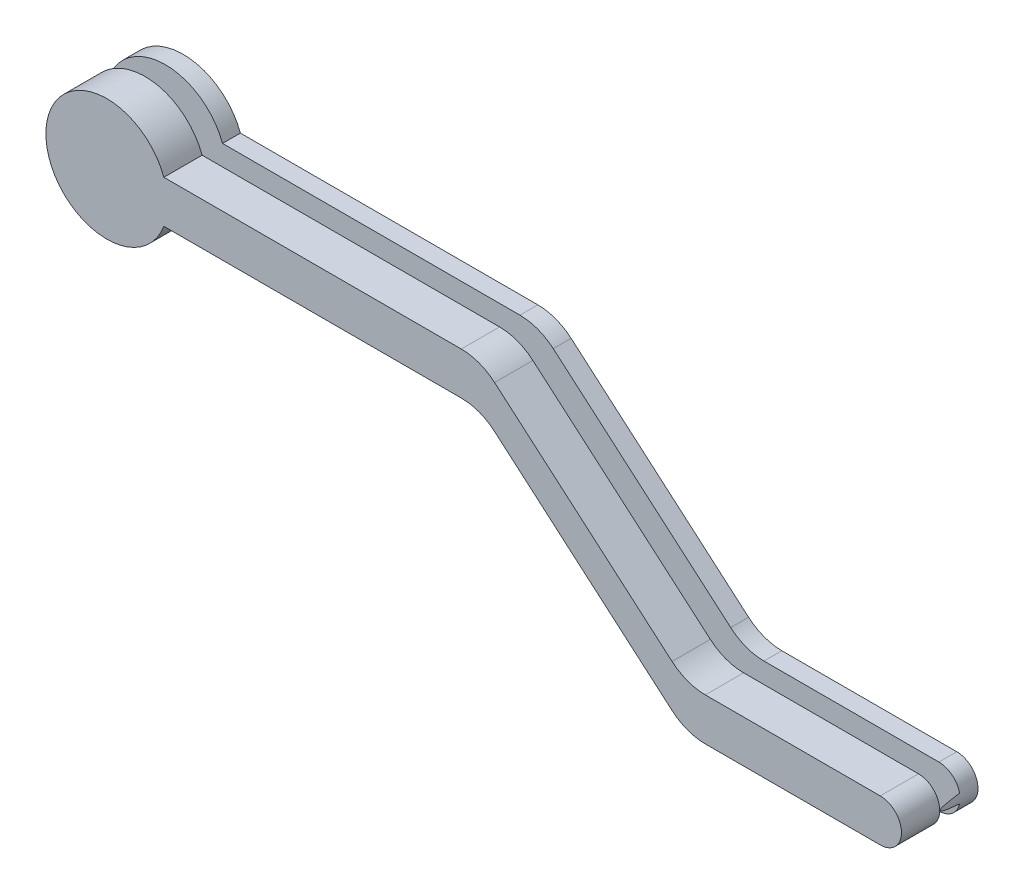
ISO-10303-21;
HEADER;
FILE_DESCRIPTION(('STEP AP214'),'2;1');
FILE_NAME('part.step','',(''),(''),'','','');
FILE_SCHEMA(('AUTOMOTIVE_DESIGN { 1 0 10303 214 1 1 1 1 }'));
ENDSEC;
DATA;
#1=APPLICATION_CONTEXT('core data for automotive mechanical design processes');
#2=APPLICATION_PROTOCOL_DEFINITION('international standard','automotive_design',2000,#1);
#3=PRODUCT_CONTEXT('',#1,'mechanical');
#4=PRODUCT('Part','Part','',(#3));
#5=PRODUCT_RELATED_PRODUCT_CATEGORY('part','',(#4));
#6=PRODUCT_DEFINITION_FORMATION('','',#4);
#7=PRODUCT_DEFINITION_CONTEXT('part definition',#1,'design');
#8=PRODUCT_DEFINITION('design','',#6,#7);
#9=PRODUCT_DEFINITION_SHAPE('','',#8);
#10=(LENGTH_UNIT() NAMED_UNIT(*) SI_UNIT(.MILLI.,.METRE.));
#11=(NAMED_UNIT(*) PLANE_ANGLE_UNIT() SI_UNIT($,.RADIAN.));
#12=(NAMED_UNIT(*) SI_UNIT($,.STERADIAN.) SOLID_ANGLE_UNIT());
#13=UNCERTAINTY_MEASURE_WITH_UNIT(LENGTH_MEASURE(1.E-05),#10,'distance_accuracy_value','');
#14=(GEOMETRIC_REPRESENTATION_CONTEXT(3) GLOBAL_UNCERTAINTY_ASSIGNED_CONTEXT((#13)) GLOBAL_UNIT_ASSIGNED_CONTEXT((#10,
#11,#12)) REPRESENTATION_CONTEXT('',''));
#15=CARTESIAN_POINT('',(0.,0.,0.));
#16=DIRECTION('',(0.,0.,1.));
#17=DIRECTION('',(1.,0.,0.));
#18=AXIS2_PLACEMENT_3D('',#15,#16,#17);
#19=CARTESIAN_POINT('',(0.,0.,15.));
#20=DIRECTION('',(0.,0.,-1.));
#21=DIRECTION('',(-1.,0.,0.));
#22=AXIS2_PLACEMENT_3D('',#19,#20,#21);
#23=CYLINDRICAL_SURFACE('',#22,11.936209112815);
#24=CARTESIAN_POINT('',(0.,0.,3.50341480726667));
#25=DIRECTION('',(0.,0.,-1.));
#26=DIRECTION('',(-1.,0.,0.));
#27=AXIS2_PLACEMENT_3D('',#24,#25,#26);
#28=CIRCLE('',#27,11.936209112815);
#29=CARTESIAN_POINT('',(11.1871739616076,-4.1617576500294,3.50341480726667));
#30=VERTEX_POINT('',#29);
#31=CARTESIAN_POINT('',(11.1871739616076,4.1617576500294,3.50341480726667));
#32=VERTEX_POINT('',#31);
#33=EDGE_CURVE('E154',#30,#32,#28,.T.);
#34=ORIENTED_EDGE('',*,*,#33,.T.);
#35=DIRECTION('',(0.,0.,-1.));
#36=VECTOR('',#35,1.);
#37=CARTESIAN_POINT('',(11.1871739616076,4.1617576500294,15.));
#38=LINE('',#37,#36);
#39=CARTESIAN_POINT('',(11.1871739616076,4.1617576500294,0.));
#40=VERTEX_POINT('',#39);
#41=EDGE_CURVE('E56',#32,#40,#38,.T.);
#42=ORIENTED_EDGE('',*,*,#41,.T.);
#43=CARTESIAN_POINT('',(0.,0.,0.));
#44=DIRECTION('',(0.,0.,1.));
#45=DIRECTION('',(1.,0.,0.));
#46=AXIS2_PLACEMENT_3D('',#43,#44,#45);
#47=CIRCLE('',#46,11.936209112815);
#48=CARTESIAN_POINT('',(11.1871739616076,-4.1617576500294,0.));
#49=VERTEX_POINT('',#48);
#50=EDGE_CURVE('E222',#40,#49,#47,.T.);
#51=ORIENTED_EDGE('',*,*,#50,.T.);
#52=DIRECTION('',(0.,0.,-1.));
#53=VECTOR('',#52,1.);
#54=CARTESIAN_POINT('',(11.1871739616076,-4.1617576500294,15.));
#55=LINE('',#54,#53);
#56=EDGE_CURVE('E206',#30,#49,#55,.T.);
#57=ORIENTED_EDGE('',*,*,#56,.F.);
#58=EDGE_LOOP('',(#34,#42,#51,#57));
#59=FACE_BOUND('',#58,.T.);
#60=ADVANCED_FACE('F53',(#59),#23,.T.);
#61=CARTESIAN_POINT('',(11.1871739616076,-4.1617576500294,15.));
#62=DIRECTION('',(0.,1.,0.));
#63=DIRECTION('',(0.,0.,1.));
#64=AXIS2_PLACEMENT_3D('',#61,#62,#63);
#65=PLANE('',#64);
#66=DIRECTION('',(0.,0.,-1.));
#67=VECTOR('',#66,1.);
#68=CARTESIAN_POINT('',(69.4870218943338,-4.1617576500294,15.));
#69=LINE('',#68,#67);
#70=CARTESIAN_POINT('',(69.4870218943338,-4.1617576500294,3.50341480726667));
#71=VERTEX_POINT('',#70);
#72=CARTESIAN_POINT('',(69.4870218943338,-4.1617576500294,0.));
#73=VERTEX_POINT('',#72);
#74=EDGE_CURVE('E202',#71,#73,#69,.T.);
#75=ORIENTED_EDGE('',*,*,#74,.F.);
#76=DIRECTION('',(-1.,0.,0.));
#77=VECTOR('',#76,1.);
#78=CARTESIAN_POINT('',(11.1871739616076,-4.1617576500294,3.50341480726667));
#79=LINE('',#78,#77);
#80=EDGE_CURVE('E209',#71,#30,#79,.T.);
#81=ORIENTED_EDGE('',*,*,#80,.T.);
#82=ORIENTED_EDGE('',*,*,#56,.T.);
#83=DIRECTION('',(1.,0.,0.));
#84=VECTOR('',#83,1.);
#85=CARTESIAN_POINT('',(11.1871739616076,-4.1617576500294,0.));
#86=LINE('',#85,#84);
#87=EDGE_CURVE('E208',#49,#73,#86,.T.);
#88=ORIENTED_EDGE('',*,*,#87,.T.);
#89=EDGE_LOOP('',(#75,#81,#82,#88));
#90=FACE_BOUND('',#89,.T.);
#91=ADVANCED_FACE('F277',(#90),#65,.F.);
#92=CARTESIAN_POINT('',(69.4870218943338,-14.1617576500294,15.));
#93=DIRECTION('',(0.,0.,-1.));
#94=DIRECTION('',(-1.,0.,0.));
#95=AXIS2_PLACEMENT_3D('',#92,#93,#94);
#96=CYLINDRICAL_SURFACE('',#95,10.);
#97=DIRECTION('',(0.,0.,-1.));
#98=VECTOR('',#97,1.);
#99=CARTESIAN_POINT('',(76.0128315018263,-6.58456760577429,15.));
#100=LINE('',#99,#98);
#101=CARTESIAN_POINT('',(76.0128315018263,-6.58456760577429,3.50341480726667));
#102=VERTEX_POINT('',#101);
#103=CARTESIAN_POINT('',(76.0128315018263,-6.58456760577429,0.));
#104=VERTEX_POINT('',#103);
#105=EDGE_CURVE('E198',#102,#104,#100,.T.);
#106=ORIENTED_EDGE('',*,*,#105,.F.);
#107=CARTESIAN_POINT('',(69.4870218943338,-14.1617576500294,3.50341480726667));
#108=DIRECTION('',(0.,0.,-1.));
#109=DIRECTION('',(-1.,0.,0.));
#110=AXIS2_PLACEMENT_3D('',#107,#108,#109);
#111=CIRCLE('',#110,10.);
#112=EDGE_CURVE('E205',#102,#71,#111,.F.);
#113=ORIENTED_EDGE('',*,*,#112,.T.);
#114=ORIENTED_EDGE('',*,*,#74,.T.);
#115=CARTESIAN_POINT('',(69.4870218943338,-14.1617576500294,0.));
#116=DIRECTION('',(0.,0.,-1.));
#117=DIRECTION('',(1.,0.,0.));
#118=AXIS2_PLACEMENT_3D('',#115,#116,#117);
#119=CIRCLE('',#118,10.);
#120=EDGE_CURVE('E204',#73,#104,#119,.T.);
#121=ORIENTED_EDGE('',*,*,#120,.T.);
#122=EDGE_LOOP('',(#106,#113,#114,#121));
#123=FACE_BOUND('',#122,.T.);
#124=ADVANCED_FACE('F282',(#123),#96,.F.);
#125=CARTESIAN_POINT('',(76.0128315018263,-6.58456760577429,15.));
#126=DIRECTION('',(0.652580960749246,0.757719004425513,0.));
#127=DIRECTION('',(-0.757719004425513,0.652580960749246,0.));
#128=AXIS2_PLACEMENT_3D('',#125,#126,#127);
#129=PLANE('',#128);
#130=DIRECTION('',(0.,0.,-1.));
#131=VECTOR('',#130,1.);
#132=CARTESIAN_POINT('',(110.79266281374,-36.538489309815,15.));
#133=LINE('',#132,#131);
#134=CARTESIAN_POINT('',(110.79266281374,-36.538489309815,3.50341480726667));
#135=VERTEX_POINT('',#134);
#136=CARTESIAN_POINT('',(110.79266281374,-36.538489309815,0.));
#137=VERTEX_POINT('',#136);
#138=EDGE_CURVE('E194',#135,#137,#133,.T.);
#139=ORIENTED_EDGE('',*,*,#138,.F.);
#140=DIRECTION('',(-0.757719004425513,0.652580960749246,0.));
#141=VECTOR('',#140,1.);
#142=CARTESIAN_POINT('',(76.0128315018263,-6.58456760577429,3.50341480726667));
#143=LINE('',#142,#141);
#144=EDGE_CURVE('E201',#135,#102,#143,.T.);
#145=ORIENTED_EDGE('',*,*,#144,.T.);
#146=ORIENTED_EDGE('',*,*,#105,.T.);
#147=DIRECTION('',(0.757719004425513,-0.652580960749246,0.));
#148=VECTOR('',#147,1.);
#149=CARTESIAN_POINT('',(76.0128315018263,-6.58456760577429,0.));
#150=LINE('',#149,#148);
#151=EDGE_CURVE('E200',#104,#137,#150,.T.);
#152=ORIENTED_EDGE('',*,*,#151,.T.);
#153=EDGE_LOOP('',(#139,#145,#146,#152));
#154=FACE_BOUND('',#153,.T.);
#155=ADVANCED_FACE('F285',(#154),#129,.F.);
#156=CARTESIAN_POINT('',(117.318472421233,-28.9612992655599,15.));
#157=DIRECTION('',(0.,0.,-1.));
#158=DIRECTION('',(-1.,0.,0.));
#159=AXIS2_PLACEMENT_3D('',#156,#157,#158);
#160=CYLINDRICAL_SURFACE('',#159,10.);
#161=DIRECTION('',(0.,0.,-1.));
#162=VECTOR('',#161,1.);
#163=CARTESIAN_POINT('',(117.318472421233,-38.9612992655599,15.));
#164=LINE('',#163,#162);
#165=CARTESIAN_POINT('',(117.318472421233,-38.9612992655599,3.50341480726667));
#166=VERTEX_POINT('',#165);
#167=CARTESIAN_POINT('',(117.318472421233,-38.9612992655599,0.));
#168=VERTEX_POINT('',#167);
#169=EDGE_CURVE('E191',#166,#168,#164,.T.);
#170=ORIENTED_EDGE('',*,*,#169,.F.);
#171=CARTESIAN_POINT('',(117.318472421233,-28.9612992655599,3.50341480726667));
#172=DIRECTION('',(0.,0.,-1.));
#173=DIRECTION('',(-1.,0.,0.));
#174=AXIS2_PLACEMENT_3D('',#171,#172,#173);
#175=CIRCLE('',#174,10.);
#176=EDGE_CURVE('E197',#166,#135,#175,.T.);
#177=ORIENTED_EDGE('',*,*,#176,.T.);
#178=ORIENTED_EDGE('',*,*,#138,.T.);
#179=CARTESIAN_POINT('',(117.318472421233,-28.9612992655599,0.));
#180=DIRECTION('',(0.,0.,1.));
#181=DIRECTION('',(-1.,0.,0.));
#182=AXIS2_PLACEMENT_3D('',#179,#180,#181);
#183=CIRCLE('',#182,10.);
#184=EDGE_CURVE('E196',#137,#168,#183,.T.);
#185=ORIENTED_EDGE('',*,*,#184,.T.);
#186=EDGE_LOOP('',(#170,#177,#178,#185));
#187=FACE_BOUND('',#186,.T.);
#188=ADVANCED_FACE('F287',(#187),#160,.T.);
#189=CARTESIAN_POINT('',(117.318472421233,-38.9612992655599,15.));
#190=DIRECTION('',(0.,1.,0.));
#191=DIRECTION('',(0.,0.,1.));
#192=AXIS2_PLACEMENT_3D('',#189,#190,#191);
#193=PLANE('',#192);
#194=DIRECTION('',(0.,0.,-1.));
#195=VECTOR('',#194,1.);
#196=CARTESIAN_POINT('',(151.60094540579,-38.9612992655599,15.));
#197=LINE('',#196,#195);
#198=CARTESIAN_POINT('',(151.60094540579,-38.9612992655599,3.50341480726667));
#199=VERTEX_POINT('',#198);
#200=CARTESIAN_POINT('',(151.60094540579,-38.9612992655599,0.));
#201=VERTEX_POINT('',#200);
#202=EDGE_CURVE('E188',#199,#201,#197,.T.);
#203=ORIENTED_EDGE('',*,*,#202,.F.);
#204=DIRECTION('',(-1.,0.,0.));
#205=VECTOR('',#204,1.);
#206=CARTESIAN_POINT('',(-11.936209112815,-38.9612992655599,3.50341480726667));
#207=LINE('',#206,#205);
#208=EDGE_CURVE('E74',#199,#166,#207,.T.);
#209=ORIENTED_EDGE('',*,*,#208,.T.);
#210=ORIENTED_EDGE('',*,*,#169,.T.);
#211=DIRECTION('',(1.,0.,0.));
#212=VECTOR('',#211,1.);
#213=CARTESIAN_POINT('',(117.318472421233,-38.9612992655599,0.));
#214=LINE('',#213,#212);
#215=EDGE_CURVE('E193',#168,#201,#214,.T.);
#216=ORIENTED_EDGE('',*,*,#215,.T.);
#217=EDGE_LOOP('',(#203,#209,#210,#216));
#218=FACE_BOUND('',#217,.T.);
#219=ADVANCED_FACE('F254',(#218),#193,.F.);
#220=CARTESIAN_POINT('',(151.60094540579,-34.7995416155305,15.));
#221=DIRECTION('',(0.,0.,-1.));
#222=DIRECTION('',(-1.,0.,0.));
#223=AXIS2_PLACEMENT_3D('',#220,#221,#222);
#224=CYLINDRICAL_SURFACE('',#223,4.16175765002941);
#225=CARTESIAN_POINT('',(151.60094540579,-34.7995416155305,-154.812224721444));
#226=DIRECTION('',(0.999671445786152,0.,-0.0256320205958389));
#227=DIRECTION('',(-0.0256320205958389,0.,-0.999671445786152));
#228=AXIS2_PLACEMENT_3D('',#225,#226,#227);
#229=ELLIPSE('',#228,162.365570613852,4.16175765002941);
#230=CARTESIAN_POINT('',(155.660228833509,-33.8816937027331,3.50341480726667));
#231=VERTEX_POINT('',#230);
#232=CARTESIAN_POINT('',(155.660228833509,-35.717389528328,3.50341480726667));
#233=VERTEX_POINT('',#232);
#234=EDGE_CURVE('E84',#231,#233,#229,.T.);
#235=ORIENTED_EDGE('',*,*,#234,.T.);
#236=CARTESIAN_POINT('',(151.60094540579,-34.7995416155305,3.50341480726667));
#237=DIRECTION('',(0.,0.,-1.));
#238=DIRECTION('',(-1.,0.,0.));
#239=AXIS2_PLACEMENT_3D('',#236,#237,#238);
#240=CIRCLE('',#239,4.16175765002941);
#241=EDGE_CURVE('E68',#233,#199,#240,.T.);
#242=ORIENTED_EDGE('',*,*,#241,.T.);
#243=ORIENTED_EDGE('',*,*,#202,.T.);
#244=CARTESIAN_POINT('',(151.60094540579,-34.7995416155305,0.));
#245=DIRECTION('',(0.,0.,1.));
#246=DIRECTION('',(-1.,0.,0.));
#247=AXIS2_PLACEMENT_3D('',#244,#245,#246);
#248=CIRCLE('',#247,4.16175765002941);
#249=CARTESIAN_POINT('',(151.60094540579,-30.6377839655011,0.));
#250=VERTEX_POINT('',#249);
#251=EDGE_CURVE('E190',#201,#250,#248,.T.);
#252=ORIENTED_EDGE('',*,*,#251,.T.);
#253=DIRECTION('',(0.,0.,-1.));
#254=VECTOR('',#253,1.);
#255=CARTESIAN_POINT('',(151.60094540579,-30.6377839655011,15.));
#256=LINE('',#255,#254);
#257=CARTESIAN_POINT('',(151.60094540579,-30.6377839655011,3.50341480726667));
#258=VERTEX_POINT('',#257);
#259=EDGE_CURVE('E184',#258,#250,#256,.T.);
#260=ORIENTED_EDGE('',*,*,#259,.F.);
#261=EDGE_CURVE('E216',#258,#231,#240,.T.);
#262=ORIENTED_EDGE('',*,*,#261,.T.);
#263=EDGE_LOOP('',(#235,#242,#243,#252,#260,#262));
#264=FACE_BOUND('',#263,.T.);
#265=ADVANCED_FACE('F252',(#264),#224,.T.);
#266=CARTESIAN_POINT('',(117.318472421233,-30.6377839655011,15.));
#267=DIRECTION('',(0.,-1.,0.));
#268=DIRECTION('',(0.,0.,-1.));
#269=AXIS2_PLACEMENT_3D('',#266,#267,#268);
#270=PLANE('',#269);
#271=DIRECTION('',(0.,0.,-1.));
#272=VECTOR('',#271,1.);
#273=CARTESIAN_POINT('',(117.318472421233,-30.6377839655011,15.));
#274=LINE('',#273,#272);
#275=CARTESIAN_POINT('',(117.318472421233,-30.6377839655011,3.50341480726667));
#276=VERTEX_POINT('',#275);
#277=CARTESIAN_POINT('',(117.318472421233,-30.6377839655011,0.));
#278=VERTEX_POINT('',#277);
#279=EDGE_CURVE('E180',#276,#278,#274,.T.);
#280=ORIENTED_EDGE('',*,*,#279,.F.);
#281=DIRECTION('',(1.,0.,0.));
#282=VECTOR('',#281,1.);
#283=CARTESIAN_POINT('',(117.318472421233,-30.6377839655011,3.50341480726667));
#284=LINE('',#283,#282);
#285=EDGE_CURVE('E187',#276,#258,#284,.T.);
#286=ORIENTED_EDGE('',*,*,#285,.T.);
#287=ORIENTED_EDGE('',*,*,#259,.T.);
#288=DIRECTION('',(-1.,0.,0.));
#289=VECTOR('',#288,1.);
#290=CARTESIAN_POINT('',(117.318472421233,-30.6377839655011,0.));
#291=LINE('',#290,#289);
#292=EDGE_CURVE('E186',#250,#278,#291,.T.);
#293=ORIENTED_EDGE('',*,*,#292,.T.);
#294=EDGE_LOOP('',(#280,#286,#287,#293));
#295=FACE_BOUND('',#294,.T.);
#296=ADVANCED_FACE('F267',(#295),#270,.F.);
#297=CARTESIAN_POINT('',(117.318472421233,-20.6377839655011,15.));
#298=DIRECTION('',(0.,0.,-1.));
#299=DIRECTION('',(-1.,0.,0.));
#300=AXIS2_PLACEMENT_3D('',#297,#298,#299);
#301=CYLINDRICAL_SURFACE('',#300,10.);
#302=DIRECTION('',(0.,0.,-1.));
#303=VECTOR('',#302,1.);
#304=CARTESIAN_POINT('',(110.79266281374,-28.2149740097562,15.));
#305=LINE('',#304,#303);
#306=CARTESIAN_POINT('',(110.79266281374,-28.2149740097562,3.50341480726667));
#307=VERTEX_POINT('',#306);
#308=CARTESIAN_POINT('',(110.79266281374,-28.2149740097562,0.));
#309=VERTEX_POINT('',#308);
#310=EDGE_CURVE('E178',#307,#309,#305,.T.);
#311=ORIENTED_EDGE('',*,*,#310,.F.);
#312=CARTESIAN_POINT('',(117.318472421233,-20.6377839655011,3.50341480726667));
#313=DIRECTION('',(0.,0.,-1.));
#314=DIRECTION('',(-1.,0.,0.));
#315=AXIS2_PLACEMENT_3D('',#312,#313,#314);
#316=CIRCLE('',#315,10.);
#317=EDGE_CURVE('E183',#307,#276,#316,.F.);
#318=ORIENTED_EDGE('',*,*,#317,.T.);
#319=ORIENTED_EDGE('',*,*,#279,.T.);
#320=CARTESIAN_POINT('',(117.318472421233,-20.6377839655011,0.));
#321=DIRECTION('',(0.,0.,-1.));
#322=DIRECTION('',(-1.,0.,0.));
#323=AXIS2_PLACEMENT_3D('',#320,#321,#322);
#324=CIRCLE('',#323,10.);
#325=EDGE_CURVE('E182',#278,#309,#324,.T.);
#326=ORIENTED_EDGE('',*,*,#325,.T.);
#327=EDGE_LOOP('',(#311,#318,#319,#326));
#328=FACE_BOUND('',#327,.T.);
#329=ADVANCED_FACE('F270',(#328),#301,.F.);
#330=CARTESIAN_POINT('',(76.0128315018263,1.73894769428451,15.));
#331=DIRECTION('',(-0.652580960749246,-0.757719004425513,0.));
#332=DIRECTION('',(0.757719004425513,-0.652580960749246,0.));
#333=AXIS2_PLACEMENT_3D('',#330,#331,#332);
#334=PLANE('',#333);
#335=DIRECTION('',(0.,0.,-1.));
#336=VECTOR('',#335,1.);
#337=CARTESIAN_POINT('',(76.0128315018263,1.73894769428451,15.));
#338=LINE('',#337,#336);
#339=CARTESIAN_POINT('',(76.0128315018263,1.73894769428451,3.50341480726667));
#340=VERTEX_POINT('',#339);
#341=CARTESIAN_POINT('',(76.0128315018263,1.73894769428451,0.));
#342=VERTEX_POINT('',#341);
#343=EDGE_CURVE('E166',#340,#342,#338,.T.);
#344=ORIENTED_EDGE('',*,*,#343,.F.);
#345=DIRECTION('',(0.757719004425514,-0.652580960749246,0.));
#346=VECTOR('',#345,1.);
#347=CARTESIAN_POINT('',(76.0128315018263,1.73894769428451,3.50341480726667));
#348=LINE('',#347,#346);
#349=EDGE_CURVE('E163',#340,#307,#348,.T.);
#350=ORIENTED_EDGE('',*,*,#349,.T.);
#351=ORIENTED_EDGE('',*,*,#310,.T.);
#352=DIRECTION('',(-0.757719004425514,0.652580960749246,0.));
#353=VECTOR('',#352,1.);
#354=CARTESIAN_POINT('',(76.0128315018263,1.73894769428451,0.));
#355=LINE('',#354,#353);
#356=EDGE_CURVE('E167',#309,#342,#355,.T.);
#357=ORIENTED_EDGE('',*,*,#356,.T.);
#358=EDGE_LOOP('',(#344,#350,#351,#357));
#359=FACE_BOUND('',#358,.T.);
#360=ADVANCED_FACE('F273',(#359),#334,.F.);
#361=CARTESIAN_POINT('',(69.4870218943338,-5.8382423499706,15.));
#362=DIRECTION('',(0.,0.,-1.));
#363=DIRECTION('',(-1.,0.,0.));
#364=AXIS2_PLACEMENT_3D('',#361,#362,#363);
#365=CYLINDRICAL_SURFACE('',#364,10.);
#366=DIRECTION('',(0.,0.,-1.));
#367=VECTOR('',#366,1.);
#368=CARTESIAN_POINT('',(69.4870218943338,4.1617576500294,15.));
#369=LINE('',#368,#367);
#370=CARTESIAN_POINT('',(69.4870218943338,4.1617576500294,3.50341480726667));
#371=VERTEX_POINT('',#370);
#372=CARTESIAN_POINT('',(69.4870218943338,4.1617576500294,0.));
#373=VERTEX_POINT('',#372);
#374=EDGE_CURVE('E95',#371,#373,#369,.T.);
#375=ORIENTED_EDGE('',*,*,#374,.F.);
#376=CARTESIAN_POINT('',(69.4870218943338,-5.8382423499706,3.50341480726667));
#377=DIRECTION('',(0.,0.,-1.));
#378=DIRECTION('',(-1.,0.,0.));
#379=AXIS2_PLACEMENT_3D('',#376,#377,#378);
#380=CIRCLE('',#379,10.);
#381=EDGE_CURVE('E158',#371,#340,#380,.T.);
#382=ORIENTED_EDGE('',*,*,#381,.T.);
#383=ORIENTED_EDGE('',*,*,#343,.T.);
#384=CARTESIAN_POINT('',(69.4870218943338,-5.8382423499706,0.));
#385=DIRECTION('',(0.,0.,1.));
#386=DIRECTION('',(1.,0.,0.));
#387=AXIS2_PLACEMENT_3D('',#384,#385,#386);
#388=CIRCLE('',#387,10.);
#389=EDGE_CURVE('E170',#342,#373,#388,.T.);
#390=ORIENTED_EDGE('',*,*,#389,.T.);
#391=EDGE_LOOP('',(#375,#382,#383,#390));
#392=FACE_BOUND('',#391,.T.);
#393=ADVANCED_FACE('F172',(#392),#365,.T.);
#394=CARTESIAN_POINT('',(11.1871739616076,4.1617576500294,15.));
#395=DIRECTION('',(0.,-1.,0.));
#396=DIRECTION('',(0.,0.,-1.));
#397=AXIS2_PLACEMENT_3D('',#394,#395,#396);
#398=PLANE('',#397);
#399=ORIENTED_EDGE('',*,*,#41,.F.);
#400=DIRECTION('',(1.,0.,0.));
#401=VECTOR('',#400,1.);
#402=CARTESIAN_POINT('',(11.1871739616076,4.1617576500294,3.50341480726667));
#403=LINE('',#402,#401);
#404=EDGE_CURVE('E160',#32,#371,#403,.T.);
#405=ORIENTED_EDGE('',*,*,#404,.T.);
#406=ORIENTED_EDGE('',*,*,#374,.T.);
#407=DIRECTION('',(-1.,0.,0.));
#408=VECTOR('',#407,1.);
#409=CARTESIAN_POINT('',(11.1871739616076,4.1617576500294,0.));
#410=LINE('',#409,#408);
#411=EDGE_CURVE('E61',#373,#40,#410,.T.);
#412=ORIENTED_EDGE('',*,*,#411,.T.);
#413=EDGE_LOOP('',(#399,#405,#406,#412));
#414=FACE_BOUND('',#413,.T.);
#415=ADVANCED_FACE('F169',(#414),#398,.F.);
#416=CARTESIAN_POINT('',(0.,0.,0.));
#417=DIRECTION('',(0.,0.,1.));
#418=DIRECTION('',(1.,0.,0.));
#419=AXIS2_PLACEMENT_3D('',#416,#417,#418);
#420=PLANE('',#419);
#421=ORIENTED_EDGE('',*,*,#50,.F.);
#422=ORIENTED_EDGE('',*,*,#411,.F.);
#423=ORIENTED_EDGE('',*,*,#389,.F.);
#424=ORIENTED_EDGE('',*,*,#356,.F.);
#425=ORIENTED_EDGE('',*,*,#325,.F.);
#426=ORIENTED_EDGE('',*,*,#292,.F.);
#427=ORIENTED_EDGE('',*,*,#251,.F.);
#428=ORIENTED_EDGE('',*,*,#215,.F.);
#429=ORIENTED_EDGE('',*,*,#184,.F.);
#430=ORIENTED_EDGE('',*,*,#151,.F.);
#431=ORIENTED_EDGE('',*,*,#120,.F.);
#432=ORIENTED_EDGE('',*,*,#87,.F.);
#433=EDGE_LOOP('',(#421,#422,#423,#424,#425,#426,#427,#428,#429,#430,#431,#432));
#434=FACE_BOUND('',#433,.T.);
#435=ADVANCED_FACE('F262',(#434),#420,.F.);
#436=CARTESIAN_POINT('',(155.660228833509,-38.9612992655599,3.50341480726667));
#437=DIRECTION('',(0.999671445786152,0.,-0.0256320205958389));
#438=DIRECTION('',(-0.0256320205958389,0.,-0.999671445786152));
#439=AXIS2_PLACEMENT_3D('',#436,#437,#438);
#440=PLANE('',#439);
#441=DIRECTION('',(0.,1.,0.));
#442=VECTOR('',#441,1.);
#443=CARTESIAN_POINT('',(155.660228833509,-38.9612992655599,3.50341480726667));
#444=LINE('',#443,#442);
#445=EDGE_CURVE('E12',#233,#231,#444,.T.);
#446=ORIENTED_EDGE('',*,*,#445,.F.);
#447=ORIENTED_EDGE('',*,*,#234,.F.);
#448=EDGE_LOOP('',(#446,#447));
#449=FACE_BOUND('',#448,.T.);
#450=ADVANCED_FACE('F377',(#449),#440,.F.);
#451=CARTESIAN_POINT('',(-11.936209112815,-38.9612992655599,3.50341480726667));
#452=DIRECTION('',(0.,0.,-1.));
#453=DIRECTION('',(-1.,0.,0.));
#454=AXIS2_PLACEMENT_3D('',#451,#452,#453);
#455=PLANE('',#454);
#456=ORIENTED_EDGE('',*,*,#445,.T.);
#457=ORIENTED_EDGE('',*,*,#261,.F.);
#458=ORIENTED_EDGE('',*,*,#285,.F.);
#459=ORIENTED_EDGE('',*,*,#317,.F.);
#460=ORIENTED_EDGE('',*,*,#349,.F.);
#461=ORIENTED_EDGE('',*,*,#381,.F.);
#462=ORIENTED_EDGE('',*,*,#404,.F.);
#463=ORIENTED_EDGE('',*,*,#33,.F.);
#464=ORIENTED_EDGE('',*,*,#80,.F.);
#465=ORIENTED_EDGE('',*,*,#112,.F.);
#466=ORIENTED_EDGE('',*,*,#144,.F.);
#467=ORIENTED_EDGE('',*,*,#176,.F.);
#468=ORIENTED_EDGE('',*,*,#208,.F.);
#469=ORIENTED_EDGE('',*,*,#241,.F.);
#470=EDGE_LOOP('',(#456,#457,#458,#459,#460,#461,#462,#463,#464,#465,#466,#467,#468,#469));
#471=FACE_BOUND('',#470,.T.);
#472=ADVANCED_FACE('F159',(#471),#455,.F.);
#473=CLOSED_SHELL('',(#60,#91,#124,#155,#188,#219,#265,#296,#329,#360,#393,#415,#435,#450,#472));
#474=MANIFOLD_SOLID_BREP('B2',#473);
#475=CARTESIAN_POINT('',(0.,0.,15.));
#476=DIRECTION('',(0.,0.,1.));
#477=DIRECTION('',(1.,0.,0.));
#478=AXIS2_PLACEMENT_3D('',#475,#476,#477);
#479=PLANE('',#478);
#480=CARTESIAN_POINT('',(0.,0.,15.));
#481=DIRECTION('',(0.,0.,1.));
#482=DIRECTION('',(1.,0.,0.));
#483=AXIS2_PLACEMENT_3D('',#480,#481,#482);
#484=CIRCLE('',#483,11.936209112815);
#485=CARTESIAN_POINT('',(11.1871739616076,4.1617576500294,15.));
#486=VERTEX_POINT('',#485);
#487=CARTESIAN_POINT('',(11.1871739616076,-4.1617576500294,15.));
#488=VERTEX_POINT('',#487);
#489=EDGE_CURVE('E519',#486,#488,#484,.T.);
#490=ORIENTED_EDGE('',*,*,#489,.T.);
#491=DIRECTION('',(1.,0.,0.));
#492=VECTOR('',#491,1.);
#493=CARTESIAN_POINT('',(11.1871739616076,-4.1617576500294,15.));
#494=LINE('',#493,#492);
#495=CARTESIAN_POINT('',(69.4870218943338,-4.1617576500294,15.));
#496=VERTEX_POINT('',#495);
#497=EDGE_CURVE('E543',#488,#496,#494,.T.);
#498=ORIENTED_EDGE('',*,*,#497,.T.);
#499=CARTESIAN_POINT('',(69.4870218943338,-14.1617576500294,15.));
#500=DIRECTION('',(0.,0.,-1.));
#501=DIRECTION('',(1.,0.,0.));
#502=AXIS2_PLACEMENT_3D('',#499,#500,#501);
#503=CIRCLE('',#502,10.);
#504=CARTESIAN_POINT('',(76.0128315018263,-6.58456760577429,15.));
#505=VERTEX_POINT('',#504);
#506=EDGE_CURVE('E559',#496,#505,#503,.T.);
#507=ORIENTED_EDGE('',*,*,#506,.T.);
#508=DIRECTION('',(0.757719004425513,-0.652580960749246,0.));
#509=VECTOR('',#508,1.);
#510=CARTESIAN_POINT('',(76.0128315018263,-6.58456760577429,15.));
#511=LINE('',#510,#509);
#512=CARTESIAN_POINT('',(110.79266281374,-36.538489309815,15.));
#513=VERTEX_POINT('',#512);
#514=EDGE_CURVE('E561',#505,#513,#511,.T.);
#515=ORIENTED_EDGE('',*,*,#514,.T.);
#516=CARTESIAN_POINT('',(117.318472421233,-28.9612992655599,15.));
#517=DIRECTION('',(0.,0.,1.));
#518=DIRECTION('',(-1.,0.,0.));
#519=AXIS2_PLACEMENT_3D('',#516,#517,#518);
#520=CIRCLE('',#519,10.);
#521=CARTESIAN_POINT('',(117.318472421233,-38.9612992655599,15.));
#522=VERTEX_POINT('',#521);
#523=EDGE_CURVE('E563',#513,#522,#520,.T.);
#524=ORIENTED_EDGE('',*,*,#523,.T.);
#525=DIRECTION('',(1.,0.,0.));
#526=VECTOR('',#525,1.);
#527=CARTESIAN_POINT('',(117.318472421233,-38.9612992655599,15.));
#528=LINE('',#527,#526);
#529=CARTESIAN_POINT('',(151.60094540579,-38.9612992655599,15.));
#530=VERTEX_POINT('',#529);
#531=EDGE_CURVE('E523',#522,#530,#528,.T.);
#532=ORIENTED_EDGE('',*,*,#531,.T.);
#533=CARTESIAN_POINT('',(151.60094540579,-34.7995416155305,15.));
#534=DIRECTION('',(0.,0.,1.));
#535=DIRECTION('',(-1.,0.,0.));
#536=AXIS2_PLACEMENT_3D('',#533,#534,#535);
#537=CIRCLE('',#536,4.16175765002941);
#538=CARTESIAN_POINT('',(151.60094540579,-30.6377839655011,15.));
#539=VERTEX_POINT('',#538);
#540=EDGE_CURVE('E566',#530,#539,#537,.T.);
#541=ORIENTED_EDGE('',*,*,#540,.T.);
#542=DIRECTION('',(-1.,0.,0.));
#543=VECTOR('',#542,1.);
#544=CARTESIAN_POINT('',(117.318472421233,-30.6377839655011,15.));
#545=LINE('',#544,#543);
#546=CARTESIAN_POINT('',(117.318472421233,-30.6377839655011,15.));
#547=VERTEX_POINT('',#546);
#548=EDGE_CURVE('E568',#539,#547,#545,.T.);
#549=ORIENTED_EDGE('',*,*,#548,.T.);
#550=CARTESIAN_POINT('',(117.318472421233,-20.6377839655011,15.));
#551=DIRECTION('',(0.,0.,-1.));
#552=DIRECTION('',(-1.,0.,0.));
#553=AXIS2_PLACEMENT_3D('',#550,#551,#552);
#554=CIRCLE('',#553,10.);
#555=CARTESIAN_POINT('',(110.79266281374,-28.2149740097562,15.));
#556=VERTEX_POINT('',#555);
#557=EDGE_CURVE('E570',#547,#556,#554,.T.);
#558=ORIENTED_EDGE('',*,*,#557,.T.);
#559=DIRECTION('',(-0.757719004425514,0.652580960749246,0.));
#560=VECTOR('',#559,1.);
#561=CARTESIAN_POINT('',(76.0128315018263,1.73894769428451,15.));
#562=LINE('',#561,#560);
#563=CARTESIAN_POINT('',(76.0128315018263,1.73894769428451,15.));
#564=VERTEX_POINT('',#563);
#565=EDGE_CURVE('E572',#556,#564,#562,.T.);
#566=ORIENTED_EDGE('',*,*,#565,.T.);
#567=CARTESIAN_POINT('',(69.4870218943338,-5.8382423499706,15.));
#568=DIRECTION('',(0.,0.,1.));
#569=DIRECTION('',(1.,0.,0.));
#570=AXIS2_PLACEMENT_3D('',#567,#568,#569);
#571=CIRCLE('',#570,10.);
#572=CARTESIAN_POINT('',(69.4870218943338,4.1617576500294,15.));
#573=VERTEX_POINT('',#572);
#574=EDGE_CURVE('E574',#564,#573,#571,.T.);
#575=ORIENTED_EDGE('',*,*,#574,.T.);
#576=DIRECTION('',(-1.,0.,0.));
#577=VECTOR('',#576,1.);
#578=CARTESIAN_POINT('',(11.1871739616076,4.1617576500294,15.));
#579=LINE('',#578,#577);
#580=EDGE_CURVE('E432',#573,#486,#579,.T.);
#581=ORIENTED_EDGE('',*,*,#580,.T.);
#582=EDGE_LOOP('',(#490,#498,#507,#515,#524,#532,#541,#549,#558,#566,#575,#581));
#583=FACE_BOUND('',#582,.T.);
#584=ADVANCED_FACE('F410',(#583),#479,.T.);
#585=CARTESIAN_POINT('',(11.1871739616076,4.1617576500294,15.));
#586=DIRECTION('',(0.,-1.,0.));
#587=DIRECTION('',(0.,0.,-1.));
#588=AXIS2_PLACEMENT_3D('',#585,#586,#587);
#589=PLANE('',#588);
#590=DIRECTION('',(0.,0.,-1.));
#591=VECTOR('',#590,1.);
#592=CARTESIAN_POINT('',(69.4870218943338,4.1617576500294,15.));
#593=LINE('',#592,#591);
#594=CARTESIAN_POINT('',(69.4870218943338,4.1617576500294,7.5));
#595=VERTEX_POINT('',#594);
#596=EDGE_CURVE('E578',#573,#595,#593,.T.);
#597=ORIENTED_EDGE('',*,*,#596,.T.);
#598=DIRECTION('',(-1.,0.,0.));
#599=VECTOR('',#598,1.);
#600=CARTESIAN_POINT('',(11.1871739616076,4.1617576500294,7.5));
#601=LINE('',#600,#599);
#602=CARTESIAN_POINT('',(11.1871739616076,4.1617576500294,7.5));
#603=VERTEX_POINT('',#602);
#604=EDGE_CURVE('E51',#595,#603,#601,.T.);
#605=ORIENTED_EDGE('',*,*,#604,.T.);
#606=DIRECTION('',(0.,0.,-1.));
#607=VECTOR('',#606,1.);
#608=CARTESIAN_POINT('',(11.1871739616076,4.1617576500294,15.));
#609=LINE('',#608,#607);
#610=EDGE_CURVE('E547',#486,#603,#609,.T.);
#611=ORIENTED_EDGE('',*,*,#610,.F.);
#612=ORIENTED_EDGE('',*,*,#580,.F.);
#613=EDGE_LOOP('',(#597,#605,#611,#612));
#614=FACE_BOUND('',#613,.T.);
#615=ADVANCED_FACE('F614',(#614),#589,.F.);
#616=CARTESIAN_POINT('',(69.4870218943338,-5.8382423499706,15.));
#617=DIRECTION('',(0.,0.,-1.));
#618=DIRECTION('',(-1.,0.,0.));
#619=AXIS2_PLACEMENT_3D('',#616,#617,#618);
#620=CYLINDRICAL_SURFACE('',#619,10.);
#621=DIRECTION('',(0.,0.,-1.));
#622=VECTOR('',#621,1.);
#623=CARTESIAN_POINT('',(76.0128315018263,1.73894769428451,15.));
#624=LINE('',#623,#622);
#625=CARTESIAN_POINT('',(76.0128315018263,1.73894769428451,7.5));
#626=VERTEX_POINT('',#625);
#627=EDGE_CURVE('E581',#564,#626,#624,.T.);
#628=ORIENTED_EDGE('',*,*,#627,.T.);
#629=CARTESIAN_POINT('',(69.4870218943338,-5.8382423499706,7.5));
#630=DIRECTION('',(0.,0.,1.));
#631=DIRECTION('',(1.,0.,0.));
#632=AXIS2_PLACEMENT_3D('',#629,#630,#631);
#633=CIRCLE('',#632,10.);
#634=EDGE_CURVE('E508',#626,#595,#633,.T.);
#635=ORIENTED_EDGE('',*,*,#634,.T.);
#636=ORIENTED_EDGE('',*,*,#596,.F.);
#637=ORIENTED_EDGE('',*,*,#574,.F.);
#638=EDGE_LOOP('',(#628,#635,#636,#637));
#639=FACE_BOUND('',#638,.T.);
#640=ADVANCED_FACE('F610',(#639),#620,.T.);
#641=CARTESIAN_POINT('',(76.0128315018263,1.73894769428451,15.));
#642=DIRECTION('',(-0.652580960749246,-0.757719004425513,0.));
#643=DIRECTION('',(0.757719004425513,-0.652580960749246,0.));
#644=AXIS2_PLACEMENT_3D('',#641,#642,#643);
#645=PLANE('',#644);
#646=DIRECTION('',(0.,0.,-1.));
#647=VECTOR('',#646,1.);
#648=CARTESIAN_POINT('',(110.79266281374,-28.2149740097562,15.));
#649=LINE('',#648,#647);
#650=CARTESIAN_POINT('',(110.79266281374,-28.2149740097562,7.5));
#651=VERTEX_POINT('',#650);
#652=EDGE_CURVE('E584',#556,#651,#649,.T.);
#653=ORIENTED_EDGE('',*,*,#652,.T.);
#654=DIRECTION('',(-0.757719004425514,0.652580960749246,0.));
#655=VECTOR('',#654,1.);
#656=CARTESIAN_POINT('',(76.0128315018263,1.73894769428451,7.5));
#657=LINE('',#656,#655);
#658=EDGE_CURVE('E602',#651,#626,#657,.T.);
#659=ORIENTED_EDGE('',*,*,#658,.T.);
#660=ORIENTED_EDGE('',*,*,#627,.F.);
#661=ORIENTED_EDGE('',*,*,#565,.F.);
#662=EDGE_LOOP('',(#653,#659,#660,#661));
#663=FACE_BOUND('',#662,.T.);
#664=ADVANCED_FACE('F621',(#663),#645,.F.);
#665=CARTESIAN_POINT('',(117.318472421233,-20.6377839655011,15.));
#666=DIRECTION('',(0.,0.,-1.));
#667=DIRECTION('',(-1.,0.,0.));
#668=AXIS2_PLACEMENT_3D('',#665,#666,#667);
#669=CYLINDRICAL_SURFACE('',#668,10.);
#670=DIRECTION('',(0.,0.,-1.));
#671=VECTOR('',#670,1.);
#672=CARTESIAN_POINT('',(117.318472421233,-30.6377839655011,15.));
#673=LINE('',#672,#671);
#674=CARTESIAN_POINT('',(117.318472421233,-30.6377839655011,7.5));
#675=VERTEX_POINT('',#674);
#676=EDGE_CURVE('E587',#547,#675,#673,.T.);
#677=ORIENTED_EDGE('',*,*,#676,.T.);
#678=CARTESIAN_POINT('',(117.318472421233,-20.6377839655011,7.5));
#679=DIRECTION('',(0.,0.,1.));
#680=DIRECTION('',(1.,0.,0.));
#681=AXIS2_PLACEMENT_3D('',#678,#679,#680);
#682=CIRCLE('',#681,10.);
#683=EDGE_CURVE('E600',#675,#651,#682,.F.);
#684=ORIENTED_EDGE('',*,*,#683,.T.);
#685=ORIENTED_EDGE('',*,*,#652,.F.);
#686=ORIENTED_EDGE('',*,*,#557,.F.);
#687=EDGE_LOOP('',(#677,#684,#685,#686));
#688=FACE_BOUND('',#687,.T.);
#689=ADVANCED_FACE('F628',(#688),#669,.F.);
#690=CARTESIAN_POINT('',(117.318472421233,-30.6377839655011,15.));
#691=DIRECTION('',(0.,-1.,0.));
#692=DIRECTION('',(0.,0.,-1.));
#693=AXIS2_PLACEMENT_3D('',#690,#691,#692);
#694=PLANE('',#693);
#695=DIRECTION('',(0.,0.,-1.));
#696=VECTOR('',#695,1.);
#697=CARTESIAN_POINT('',(151.60094540579,-30.6377839655011,15.));
#698=LINE('',#697,#696);
#699=CARTESIAN_POINT('',(151.60094540579,-30.6377839655011,7.5));
#700=VERTEX_POINT('',#699);
#701=EDGE_CURVE('E528',#539,#700,#698,.T.);
#702=ORIENTED_EDGE('',*,*,#701,.T.);
#703=DIRECTION('',(-1.,0.,0.));
#704=VECTOR('',#703,1.);
#705=CARTESIAN_POINT('',(117.318472421233,-30.6377839655011,7.5));
#706=LINE('',#705,#704);
#707=EDGE_CURVE('E548',#700,#675,#706,.T.);
#708=ORIENTED_EDGE('',*,*,#707,.T.);
#709=ORIENTED_EDGE('',*,*,#676,.F.);
#710=ORIENTED_EDGE('',*,*,#548,.F.);
#711=EDGE_LOOP('',(#702,#708,#709,#710));
#712=FACE_BOUND('',#711,.T.);
#713=ADVANCED_FACE('F594',(#712),#694,.F.);
#714=CARTESIAN_POINT('',(151.60094540579,-34.7995416155305,15.));
#715=DIRECTION('',(0.,0.,-1.));
#716=DIRECTION('',(-1.,0.,0.));
#717=AXIS2_PLACEMENT_3D('',#714,#715,#716);
#718=CYLINDRICAL_SURFACE('',#717,4.16175765002941);
#719=CARTESIAN_POINT('',(151.60094540579,-34.7995416155305,7.5));
#720=DIRECTION('',(0.,0.,1.));
#721=DIRECTION('',(1.,0.,0.));
#722=AXIS2_PLACEMENT_3D('',#719,#720,#721);
#723=CIRCLE('',#722,4.16175765002941);
#724=CARTESIAN_POINT('',(151.60094540579,-38.9612992655599,7.5));
#725=VERTEX_POINT('',#724);
#726=EDGE_CURVE('E503',#725,#700,#723,.T.);
#727=ORIENTED_EDGE('',*,*,#726,.T.);
#728=ORIENTED_EDGE('',*,*,#701,.F.);
#729=ORIENTED_EDGE('',*,*,#540,.F.);
#730=DIRECTION('',(0.,0.,-1.));
#731=VECTOR('',#730,1.);
#732=CARTESIAN_POINT('',(151.60094540579,-38.9612992655599,15.));
#733=LINE('',#732,#731);
#734=EDGE_CURVE('E524',#530,#725,#733,.T.);
#735=ORIENTED_EDGE('',*,*,#734,.T.);
#736=EDGE_LOOP('',(#727,#728,#729,#735));
#737=FACE_BOUND('',#736,.T.);
#738=ADVANCED_FACE('F598',(#737),#718,.T.);
#739=CARTESIAN_POINT('',(117.318472421233,-38.9612992655599,15.));
#740=DIRECTION('',(0.,1.,0.));
#741=DIRECTION('',(0.,0.,1.));
#742=AXIS2_PLACEMENT_3D('',#739,#740,#741);
#743=PLANE('',#742);
#744=DIRECTION('',(0.,0.,-1.));
#745=VECTOR('',#744,1.);
#746=CARTESIAN_POINT('',(117.318472421233,-38.9612992655599,15.));
#747=LINE('',#746,#745);
#748=CARTESIAN_POINT('',(117.318472421233,-38.9612992655599,7.5));
#749=VERTEX_POINT('',#748);
#750=EDGE_CURVE('E515',#522,#749,#747,.T.);
#751=ORIENTED_EDGE('',*,*,#750,.T.);
#752=DIRECTION('',(1.,0.,0.));
#753=VECTOR('',#752,1.);
#754=CARTESIAN_POINT('',(-11.936209112815,-38.9612992655599,7.5));
#755=LINE('',#754,#753);
#756=EDGE_CURVE('E497',#749,#725,#755,.T.);
#757=ORIENTED_EDGE('',*,*,#756,.T.);
#758=ORIENTED_EDGE('',*,*,#734,.F.);
#759=ORIENTED_EDGE('',*,*,#531,.F.);
#760=EDGE_LOOP('',(#751,#757,#758,#759));
#761=FACE_BOUND('',#760,.T.);
#762=ADVANCED_FACE('F522',(#761),#743,.F.);
#763=CARTESIAN_POINT('',(117.318472421233,-28.9612992655599,15.));
#764=DIRECTION('',(0.,0.,-1.));
#765=DIRECTION('',(-1.,0.,0.));
#766=AXIS2_PLACEMENT_3D('',#763,#764,#765);
#767=CYLINDRICAL_SURFACE('',#766,10.);
#768=DIRECTION('',(0.,0.,-1.));
#769=VECTOR('',#768,1.);
#770=CARTESIAN_POINT('',(110.79266281374,-36.538489309815,15.));
#771=LINE('',#770,#769);
#772=CARTESIAN_POINT('',(110.79266281374,-36.538489309815,7.5));
#773=VERTEX_POINT('',#772);
#774=EDGE_CURVE('E518',#513,#773,#771,.T.);
#775=ORIENTED_EDGE('',*,*,#774,.T.);
#776=CARTESIAN_POINT('',(117.318472421233,-28.9612992655599,7.5));
#777=DIRECTION('',(0.,0.,1.));
#778=DIRECTION('',(1.,0.,0.));
#779=AXIS2_PLACEMENT_3D('',#776,#777,#778);
#780=CIRCLE('',#779,10.);
#781=EDGE_CURVE('E500',#773,#749,#780,.T.);
#782=ORIENTED_EDGE('',*,*,#781,.T.);
#783=ORIENTED_EDGE('',*,*,#750,.F.);
#784=ORIENTED_EDGE('',*,*,#523,.F.);
#785=EDGE_LOOP('',(#775,#782,#783,#784));
#786=FACE_BOUND('',#785,.T.);
#787=ADVANCED_FACE('F513',(#786),#767,.T.);
#788=CARTESIAN_POINT('',(76.0128315018263,-6.58456760577429,15.));
#789=DIRECTION('',(0.652580960749246,0.757719004425513,0.));
#790=DIRECTION('',(-0.757719004425513,0.652580960749246,0.));
#791=AXIS2_PLACEMENT_3D('',#788,#789,#790);
#792=PLANE('',#791);
#793=DIRECTION('',(0.,0.,-1.));
#794=VECTOR('',#793,1.);
#795=CARTESIAN_POINT('',(76.0128315018263,-6.58456760577429,15.));
#796=LINE('',#795,#794);
#797=CARTESIAN_POINT('',(76.0128315018263,-6.58456760577429,7.5));
#798=VERTEX_POINT('',#797);
#799=EDGE_CURVE('E526',#505,#798,#796,.T.);
#800=ORIENTED_EDGE('',*,*,#799,.T.);
#801=DIRECTION('',(0.757719004425513,-0.652580960749246,0.));
#802=VECTOR('',#801,1.);
#803=CARTESIAN_POINT('',(76.0128315018263,-6.58456760577429,7.5));
#804=LINE('',#803,#802);
#805=EDGE_CURVE('E520',#798,#773,#804,.T.);
#806=ORIENTED_EDGE('',*,*,#805,.T.);
#807=ORIENTED_EDGE('',*,*,#774,.F.);
#808=ORIENTED_EDGE('',*,*,#514,.F.);
#809=EDGE_LOOP('',(#800,#806,#807,#808));
#810=FACE_BOUND('',#809,.T.);
#811=ADVANCED_FACE('F641',(#810),#792,.F.);
#812=CARTESIAN_POINT('',(69.4870218943338,-14.1617576500294,15.));
#813=DIRECTION('',(0.,0.,-1.));
#814=DIRECTION('',(-1.,0.,0.));
#815=AXIS2_PLACEMENT_3D('',#812,#813,#814);
#816=CYLINDRICAL_SURFACE('',#815,10.);
#817=DIRECTION('',(0.,0.,-1.));
#818=VECTOR('',#817,1.);
#819=CARTESIAN_POINT('',(69.4870218943338,-4.1617576500294,15.));
#820=LINE('',#819,#818);
#821=CARTESIAN_POINT('',(69.4870218943338,-4.1617576500294,7.5));
#822=VERTEX_POINT('',#821);
#823=EDGE_CURVE('E534',#496,#822,#820,.T.);
#824=ORIENTED_EDGE('',*,*,#823,.T.);
#825=CARTESIAN_POINT('',(69.4870218943338,-14.1617576500294,7.5));
#826=DIRECTION('',(0.,0.,1.));
#827=DIRECTION('',(1.,0.,0.));
#828=AXIS2_PLACEMENT_3D('',#825,#826,#827);
#829=CIRCLE('',#828,10.);
#830=EDGE_CURVE('E551',#822,#798,#829,.F.);
#831=ORIENTED_EDGE('',*,*,#830,.T.);
#832=ORIENTED_EDGE('',*,*,#799,.F.);
#833=ORIENTED_EDGE('',*,*,#506,.F.);
#834=EDGE_LOOP('',(#824,#831,#832,#833));
#835=FACE_BOUND('',#834,.T.);
#836=ADVANCED_FACE('F644',(#835),#816,.F.);
#837=CARTESIAN_POINT('',(11.1871739616076,-4.1617576500294,15.));
#838=DIRECTION('',(0.,1.,0.));
#839=DIRECTION('',(0.,0.,1.));
#840=AXIS2_PLACEMENT_3D('',#837,#838,#839);
#841=PLANE('',#840);
#842=DIRECTION('',(0.,0.,-1.));
#843=VECTOR('',#842,1.);
#844=CARTESIAN_POINT('',(11.1871739616076,-4.1617576500294,15.));
#845=LINE('',#844,#843);
#846=CARTESIAN_POINT('',(11.1871739616076,-4.1617576500294,7.5));
#847=VERTEX_POINT('',#846);
#848=EDGE_CURVE('E418',#488,#847,#845,.T.);
#849=ORIENTED_EDGE('',*,*,#848,.T.);
#850=DIRECTION('',(1.,0.,0.));
#851=VECTOR('',#850,1.);
#852=CARTESIAN_POINT('',(11.1871739616076,-4.1617576500294,7.5));
#853=LINE('',#852,#851);
#854=EDGE_CURVE('E542',#847,#822,#853,.T.);
#855=ORIENTED_EDGE('',*,*,#854,.T.);
#856=ORIENTED_EDGE('',*,*,#823,.F.);
#857=ORIENTED_EDGE('',*,*,#497,.F.);
#858=EDGE_LOOP('',(#849,#855,#856,#857));
#859=FACE_BOUND('',#858,.T.);
#860=ADVANCED_FACE('F540',(#859),#841,.F.);
#861=CARTESIAN_POINT('',(0.,0.,15.));
#862=DIRECTION('',(0.,0.,-1.));
#863=DIRECTION('',(-1.,0.,0.));
#864=AXIS2_PLACEMENT_3D('',#861,#862,#863);
#865=CYLINDRICAL_SURFACE('',#864,11.936209112815);
#866=CARTESIAN_POINT('',(0.,0.,7.5));
#867=DIRECTION('',(0.,0.,1.));
#868=DIRECTION('',(1.,0.,0.));
#869=AXIS2_PLACEMENT_3D('',#866,#867,#868);
#870=CIRCLE('',#869,11.936209112815);
#871=EDGE_CURVE('E425',#603,#847,#870,.T.);
#872=ORIENTED_EDGE('',*,*,#871,.T.);
#873=ORIENTED_EDGE('',*,*,#848,.F.);
#874=ORIENTED_EDGE('',*,*,#489,.F.);
#875=ORIENTED_EDGE('',*,*,#610,.T.);
#876=EDGE_LOOP('',(#872,#873,#874,#875));
#877=FACE_BOUND('',#876,.T.);
#878=ADVANCED_FACE('F412',(#877),#865,.T.);
#879=CARTESIAN_POINT('',(-11.936209112815,-38.9612992655599,7.5));
#880=DIRECTION('',(0.,0.,1.));
#881=DIRECTION('',(1.,0.,0.));
#882=AXIS2_PLACEMENT_3D('',#879,#880,#881);
#883=PLANE('',#882);
#884=ORIENTED_EDGE('',*,*,#805,.F.);
#885=ORIENTED_EDGE('',*,*,#830,.F.);
#886=ORIENTED_EDGE('',*,*,#854,.F.);
#887=ORIENTED_EDGE('',*,*,#871,.F.);
#888=ORIENTED_EDGE('',*,*,#604,.F.);
#889=ORIENTED_EDGE('',*,*,#634,.F.);
#890=ORIENTED_EDGE('',*,*,#658,.F.);
#891=ORIENTED_EDGE('',*,*,#683,.F.);
#892=ORIENTED_EDGE('',*,*,#707,.F.);
#893=ORIENTED_EDGE('',*,*,#726,.F.);
#894=ORIENTED_EDGE('',*,*,#756,.F.);
#895=ORIENTED_EDGE('',*,*,#781,.F.);
#896=EDGE_LOOP('',(#884,#885,#886,#887,#888,#889,#890,#891,#892,#893,#894,#895));
#897=FACE_BOUND('',#896,.T.);
#898=ADVANCED_FACE('F499',(#897),#883,.F.);
#899=CLOSED_SHELL('',(#584,#615,#640,#664,#689,#713,#738,#762,#787,#811,#836,#860,#878,#898));
#900=MANIFOLD_SOLID_BREP('B6',#899);
#901=ADVANCED_BREP_SHAPE_REPRESENTATION('',(#18,#474,#900),#14);
#902=SHAPE_DEFINITION_REPRESENTATION(#9,#901);
ENDSEC;
END-ISO-10303-21;
